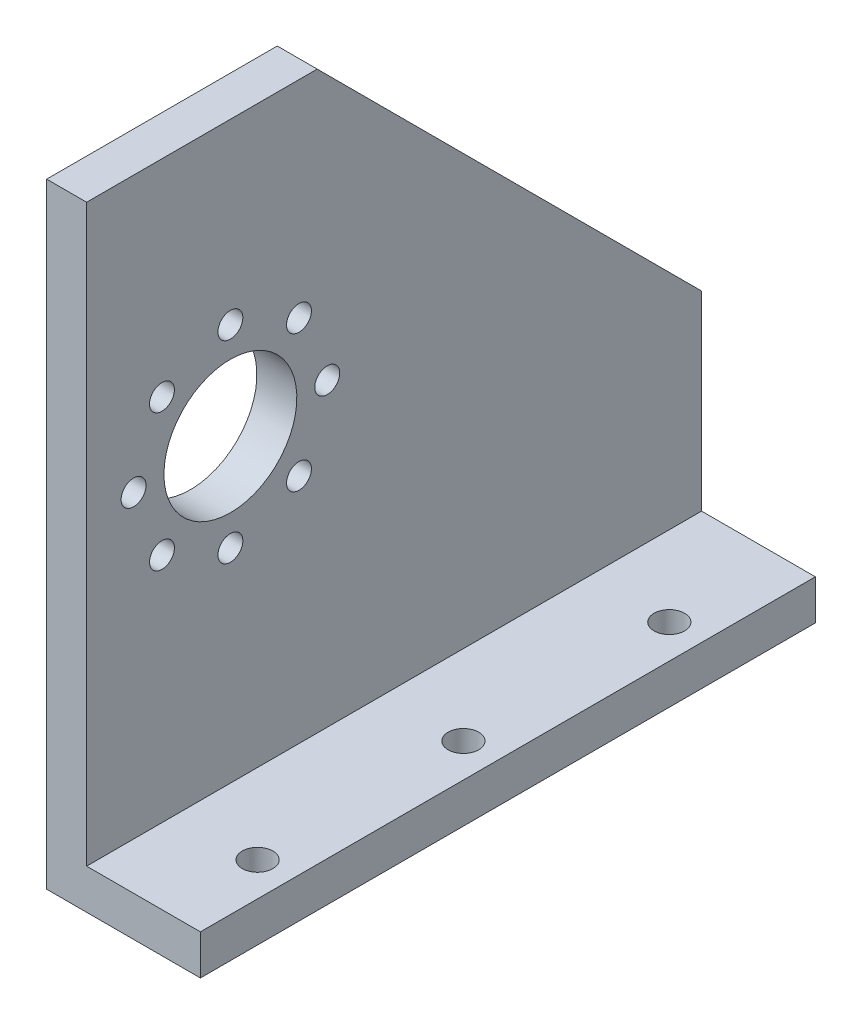
ISO-10303-21;
HEADER;
FILE_DESCRIPTION(('STEP AP214'),'2;1');
FILE_NAME('part.step','',(''),(''),'','','');
FILE_SCHEMA(('AUTOMOTIVE_DESIGN { 1 0 10303 214 1 1 1 1 }'));
ENDSEC;
DATA;
#1=APPLICATION_CONTEXT('core data for automotive mechanical design processes');
#2=APPLICATION_PROTOCOL_DEFINITION('international standard','automotive_design',2000,#1);
#3=PRODUCT_CONTEXT('',#1,'mechanical');
#4=PRODUCT('Part','Part','',(#3));
#5=PRODUCT_RELATED_PRODUCT_CATEGORY('part','',(#4));
#6=PRODUCT_DEFINITION_FORMATION('','',#4);
#7=PRODUCT_DEFINITION_CONTEXT('part definition',#1,'design');
#8=PRODUCT_DEFINITION('design','',#6,#7);
#9=PRODUCT_DEFINITION_SHAPE('','',#8);
#10=(LENGTH_UNIT() NAMED_UNIT(*) SI_UNIT(.MILLI.,.METRE.));
#11=(NAMED_UNIT(*) PLANE_ANGLE_UNIT() SI_UNIT($,.RADIAN.));
#12=(NAMED_UNIT(*) SI_UNIT($,.STERADIAN.) SOLID_ANGLE_UNIT());
#13=UNCERTAINTY_MEASURE_WITH_UNIT(LENGTH_MEASURE(1.E-05),#10,'distance_accuracy_value','');
#14=(GEOMETRIC_REPRESENTATION_CONTEXT(3) GLOBAL_UNCERTAINTY_ASSIGNED_CONTEXT((#13)) GLOBAL_UNIT_ASSIGNED_CONTEXT((#10,
#11,#12)) REPRESENTATION_CONTEXT('',''));
#15=CARTESIAN_POINT('',(0.,0.,0.));
#16=DIRECTION('',(0.,0.,1.));
#17=DIRECTION('',(1.,0.,0.));
#18=AXIS2_PLACEMENT_3D('',#15,#16,#17);
#19=CARTESIAN_POINT('',(12.7,0.,50.8));
#20=DIRECTION('',(0.,1.,0.));
#21=DIRECTION('',(-1.,0.,0.));
#22=AXIS2_PLACEMENT_3D('',#19,#20,#21);
#23=PLANE('',#22);
#24=CARTESIAN_POINT('',(9.90870521282941,0.,43.2834100284563));
#25=DIRECTION('',(0.,-1.,0.));
#26=DIRECTION('',(0.,0.,-1.));
#27=AXIS2_PLACEMENT_3D('',#24,#25,#26);
#28=CIRCLE('',#27,1.26364999999999);
#29=CARTESIAN_POINT('',(9.90870521282941,0.,42.0197600284564));
#30=VERTEX_POINT('',#29);
#31=EDGE_CURVE('E154',#30,#30,#28,.T.);
#32=ORIENTED_EDGE('',*,*,#31,.F.);
#33=EDGE_LOOP('',(#32));
#34=FACE_BOUND('',#33,.T.);
#35=CARTESIAN_POINT('',(9.90870521282941,0.,26.2817034848547));
#36=DIRECTION('',(0.,-1.,0.));
#37=DIRECTION('',(0.,0.,-1.));
#38=AXIS2_PLACEMENT_3D('',#35,#36,#37);
#39=CIRCLE('',#38,1.26364999999999);
#40=CARTESIAN_POINT('',(9.90870521282941,0.,25.0180534848547));
#41=VERTEX_POINT('',#40);
#42=EDGE_CURVE('E151',#41,#41,#39,.T.);
#43=ORIENTED_EDGE('',*,*,#42,.F.);
#44=EDGE_LOOP('',(#43));
#45=FACE_BOUND('',#44,.T.);
#46=CARTESIAN_POINT('',(9.90870521282941,0.,9.2701270850744));
#47=DIRECTION('',(0.,-1.,0.));
#48=DIRECTION('',(0.,0.,-1.));
#49=AXIS2_PLACEMENT_3D('',#46,#47,#48);
#50=CIRCLE('',#49,1.26364999999999);
#51=CARTESIAN_POINT('',(9.90870521282941,0.,8.00647708507442));
#52=VERTEX_POINT('',#51);
#53=EDGE_CURVE('E148',#52,#52,#50,.T.);
#54=ORIENTED_EDGE('',*,*,#53,.F.);
#55=EDGE_LOOP('',(#54));
#56=FACE_BOUND('',#55,.T.);
#57=DIRECTION('',(1.,0.,0.));
#58=VECTOR('',#57,1.);
#59=CARTESIAN_POINT('',(12.7,0.,0.));
#60=LINE('',#59,#58);
#61=CARTESIAN_POINT('',(0.,0.,0.));
#62=VERTEX_POINT('',#61);
#63=CARTESIAN_POINT('',(12.7,0.,0.));
#64=VERTEX_POINT('',#63);
#65=EDGE_CURVE('E127',#62,#64,#60,.T.);
#66=ORIENTED_EDGE('',*,*,#65,.T.);
#67=DIRECTION('',(0.,0.,-1.));
#68=VECTOR('',#67,1.);
#69=CARTESIAN_POINT('',(12.7,0.,50.8));
#70=LINE('',#69,#68);
#71=CARTESIAN_POINT('',(12.7,0.,50.8));
#72=VERTEX_POINT('',#71);
#73=EDGE_CURVE('E45',#72,#64,#70,.T.);
#74=ORIENTED_EDGE('',*,*,#73,.F.);
#75=DIRECTION('',(1.,0.,0.));
#76=VECTOR('',#75,1.);
#77=CARTESIAN_POINT('',(12.7,0.,50.8));
#78=LINE('',#77,#76);
#79=CARTESIAN_POINT('',(0.,0.,50.8));
#80=VERTEX_POINT('',#79);
#81=EDGE_CURVE('E138',#80,#72,#78,.T.);
#82=ORIENTED_EDGE('',*,*,#81,.F.);
#83=DIRECTION('',(0.,0.,-1.));
#84=VECTOR('',#83,1.);
#85=CARTESIAN_POINT('',(0.,0.,50.8));
#86=LINE('',#85,#84);
#87=EDGE_CURVE('E123',#80,#62,#86,.T.);
#88=ORIENTED_EDGE('',*,*,#87,.T.);
#89=EDGE_LOOP('',(#66,#74,#82,#88));
#90=FACE_BOUND('',#89,.T.);
#91=ADVANCED_FACE('F38',(#34,#45,#56,#90),#23,.F.);
#92=CARTESIAN_POINT('',(12.7,3.302,50.8));
#93=DIRECTION('',(-1.,0.,0.));
#94=DIRECTION('',(0.,0.,1.));
#95=AXIS2_PLACEMENT_3D('',#92,#93,#94);
#96=PLANE('',#95);
#97=DIRECTION('',(0.,1.,0.));
#98=VECTOR('',#97,1.);
#99=CARTESIAN_POINT('',(12.7,3.302,0.));
#100=LINE('',#99,#98);
#101=CARTESIAN_POINT('',(12.7,3.302,0.));
#102=VERTEX_POINT('',#101);
#103=EDGE_CURVE('E130',#64,#102,#100,.T.);
#104=ORIENTED_EDGE('',*,*,#103,.T.);
#105=DIRECTION('',(0.,0.,-1.));
#106=VECTOR('',#105,1.);
#107=CARTESIAN_POINT('',(12.7,3.302,50.8));
#108=LINE('',#107,#106);
#109=CARTESIAN_POINT('',(12.7,3.302,50.8));
#110=VERTEX_POINT('',#109);
#111=EDGE_CURVE('E142',#110,#102,#108,.T.);
#112=ORIENTED_EDGE('',*,*,#111,.F.);
#113=DIRECTION('',(0.,1.,0.));
#114=VECTOR('',#113,1.);
#115=CARTESIAN_POINT('',(12.7,3.302,50.8));
#116=LINE('',#115,#114);
#117=EDGE_CURVE('E90',#72,#110,#116,.T.);
#118=ORIENTED_EDGE('',*,*,#117,.F.);
#119=ORIENTED_EDGE('',*,*,#73,.T.);
#120=EDGE_LOOP('',(#104,#112,#118,#119));
#121=FACE_BOUND('',#120,.T.);
#122=ADVANCED_FACE('F174',(#121),#96,.F.);
#123=CARTESIAN_POINT('',(3.30200000000001,3.302,50.8));
#124=DIRECTION('',(0.,-1.,0.));
#125=DIRECTION('',(1.,0.,0.));
#126=AXIS2_PLACEMENT_3D('',#123,#124,#125);
#127=PLANE('',#126);
#128=CARTESIAN_POINT('',(9.90870521282941,3.302,43.2834100284563));
#129=DIRECTION('',(0.,-1.,0.));
#130=DIRECTION('',(1.,0.,0.));
#131=AXIS2_PLACEMENT_3D('',#128,#129,#130);
#132=CIRCLE('',#131,1.26364999999999);
#133=CARTESIAN_POINT('',(11.1723552128294,3.302,43.2834100284563));
#134=VERTEX_POINT('',#133);
#135=EDGE_CURVE('E152',#134,#134,#132,.T.);
#136=ORIENTED_EDGE('',*,*,#135,.T.);
#137=EDGE_LOOP('',(#136));
#138=FACE_BOUND('',#137,.T.);
#139=CARTESIAN_POINT('',(9.90870521282941,3.302,26.2817034848547));
#140=DIRECTION('',(0.,-1.,0.));
#141=DIRECTION('',(1.,0.,0.));
#142=AXIS2_PLACEMENT_3D('',#139,#140,#141);
#143=CIRCLE('',#142,1.26364999999999);
#144=CARTESIAN_POINT('',(11.1723552128294,3.302,26.2817034848547));
#145=VERTEX_POINT('',#144);
#146=EDGE_CURVE('E149',#145,#145,#143,.T.);
#147=ORIENTED_EDGE('',*,*,#146,.T.);
#148=EDGE_LOOP('',(#147));
#149=FACE_BOUND('',#148,.T.);
#150=CARTESIAN_POINT('',(9.90870521282941,3.302,9.2701270850744));
#151=DIRECTION('',(0.,-1.,0.));
#152=DIRECTION('',(1.,0.,0.));
#153=AXIS2_PLACEMENT_3D('',#150,#151,#152);
#154=CIRCLE('',#153,1.26364999999999);
#155=CARTESIAN_POINT('',(11.1723552128294,3.302,9.2701270850744));
#156=VERTEX_POINT('',#155);
#157=EDGE_CURVE('E131',#156,#156,#154,.T.);
#158=ORIENTED_EDGE('',*,*,#157,.T.);
#159=EDGE_LOOP('',(#158));
#160=FACE_BOUND('',#159,.T.);
#161=DIRECTION('',(-1.,0.,0.));
#162=VECTOR('',#161,1.);
#163=CARTESIAN_POINT('',(3.30200000000001,3.302,0.));
#164=LINE('',#163,#162);
#165=CARTESIAN_POINT('',(3.30200000000001,3.302,0.));
#166=VERTEX_POINT('',#165);
#167=EDGE_CURVE('E133',#102,#166,#164,.T.);
#168=ORIENTED_EDGE('',*,*,#167,.T.);
#169=DIRECTION('',(0.,0.,-1.));
#170=VECTOR('',#169,1.);
#171=CARTESIAN_POINT('',(3.30200000000001,3.302,50.8));
#172=LINE('',#171,#170);
#173=CARTESIAN_POINT('',(3.30200000000001,3.302,50.8));
#174=VERTEX_POINT('',#173);
#175=EDGE_CURVE('E117',#174,#166,#172,.T.);
#176=ORIENTED_EDGE('',*,*,#175,.F.);
#177=DIRECTION('',(-1.,0.,0.));
#178=VECTOR('',#177,1.);
#179=CARTESIAN_POINT('',(3.30200000000001,3.302,50.8));
#180=LINE('',#179,#178);
#181=EDGE_CURVE('E106',#110,#174,#180,.T.);
#182=ORIENTED_EDGE('',*,*,#181,.F.);
#183=ORIENTED_EDGE('',*,*,#111,.T.);
#184=EDGE_LOOP('',(#168,#176,#182,#183));
#185=FACE_BOUND('',#184,.T.);
#186=ADVANCED_FACE('F177',(#138,#149,#160,#185),#127,.F.);
#187=CARTESIAN_POINT('',(3.302,50.8,50.8));
#188=DIRECTION('',(-1.,0.,0.));
#189=DIRECTION('',(0.,-1.,0.));
#190=AXIS2_PLACEMENT_3D('',#187,#188,#189);
#191=PLANE('',#190);
#192=CARTESIAN_POINT('',(3.302,28.1327030708297,38.9240521092831));
#193=DIRECTION('',(-1.,0.,0.));
#194=DIRECTION('',(0.,-1.,0.));
#195=AXIS2_PLACEMENT_3D('',#192,#193,#194);
#196=CIRCLE('',#195,5.48985451159772);
#197=CARTESIAN_POINT('',(3.302,22.6428485592319,38.9240521092831));
#198=VERTEX_POINT('',#197);
#199=EDGE_CURVE('E196',#198,#198,#196,.T.);
#200=ORIENTED_EDGE('',*,*,#199,.T.);
#201=EDGE_LOOP('',(#200));
#202=FACE_BOUND('',#201,.T.);
#203=CARTESIAN_POINT('',(3.302,20.1327030708297,38.9240521092829));
#204=DIRECTION('',(-1.,0.,0.));
#205=DIRECTION('',(0.,-1.,0.));
#206=AXIS2_PLACEMENT_3D('',#203,#204,#205);
#207=CIRCLE('',#206,1.0287);
#208=CARTESIAN_POINT('',(3.302,19.1040030708297,38.9240521092829));
#209=VERTEX_POINT('',#208);
#210=EDGE_CURVE('E202',#209,#209,#207,.T.);
#211=ORIENTED_EDGE('',*,*,#210,.T.);
#212=EDGE_LOOP('',(#211));
#213=FACE_BOUND('',#212,.T.);
#214=CARTESIAN_POINT('',(3.302,22.4501495097673,33.2567320007666));
#215=DIRECTION('',(-1.,0.,0.));
#216=DIRECTION('',(0.,-1.,0.));
#217=AXIS2_PLACEMENT_3D('',#214,#215,#216);
#218=CIRCLE('',#217,1.0287);
#219=CARTESIAN_POINT('',(3.302,21.4214495097673,33.2567320007666));
#220=VERTEX_POINT('',#219);
#221=EDGE_CURVE('E208',#220,#220,#218,.T.);
#222=ORIENTED_EDGE('',*,*,#221,.T.);
#223=EDGE_LOOP('',(#222));
#224=FACE_BOUND('',#223,.T.);
#225=CARTESIAN_POINT('',(3.302,28.1327030708298,30.924052109283));
#226=DIRECTION('',(-1.,0.,0.));
#227=DIRECTION('',(0.,-1.,0.));
#228=AXIS2_PLACEMENT_3D('',#225,#226,#227);
#229=CIRCLE('',#228,1.0287);
#230=CARTESIAN_POINT('',(3.302,27.1040030708298,30.924052109283));
#231=VERTEX_POINT('',#230);
#232=EDGE_CURVE('E214',#231,#231,#229,.T.);
#233=ORIENTED_EDGE('',*,*,#232,.T.);
#234=EDGE_LOOP('',(#233));
#235=FACE_BOUND('',#234,.T.);
#236=CARTESIAN_POINT('',(3.302,33.7546085060607,33.2567320007666));
#237=DIRECTION('',(-1.,0.,0.));
#238=DIRECTION('',(0.,-1.,0.));
#239=AXIS2_PLACEMENT_3D('',#236,#237,#238);
#240=CIRCLE('',#239,1.0287);
#241=CARTESIAN_POINT('',(3.302,32.7259085060607,33.2567320007666));
#242=VERTEX_POINT('',#241);
#243=EDGE_CURVE('E220',#242,#242,#240,.T.);
#244=ORIENTED_EDGE('',*,*,#243,.T.);
#245=EDGE_LOOP('',(#244));
#246=FACE_BOUND('',#245,.T.);
#247=CARTESIAN_POINT('',(3.302,36.0967673231195,38.9240521092829));
#248=DIRECTION('',(-1.,0.,0.));
#249=DIRECTION('',(0.,-1.,0.));
#250=AXIS2_PLACEMENT_3D('',#247,#248,#249);
#251=CIRCLE('',#250,1.0287);
#252=CARTESIAN_POINT('',(3.302,35.0680673231195,38.9240521092829));
#253=VERTEX_POINT('',#252);
#254=EDGE_CURVE('E226',#253,#253,#251,.T.);
#255=ORIENTED_EDGE('',*,*,#254,.T.);
#256=EDGE_LOOP('',(#255));
#257=FACE_BOUND('',#256,.T.);
#258=CARTESIAN_POINT('',(3.302,33.7636673841721,44.5765883182915));
#259=DIRECTION('',(-1.,0.,0.));
#260=DIRECTION('',(0.,-1.,0.));
#261=AXIS2_PLACEMENT_3D('',#258,#259,#260);
#262=CIRCLE('',#261,1.0287);
#263=CARTESIAN_POINT('',(3.302,32.7349673841721,44.5765883182915));
#264=VERTEX_POINT('',#263);
#265=EDGE_CURVE('E232',#264,#264,#262,.T.);
#266=ORIENTED_EDGE('',*,*,#265,.T.);
#267=EDGE_LOOP('',(#266));
#268=FACE_BOUND('',#267,.T.);
#269=CARTESIAN_POINT('',(3.302,28.1016040637977,46.9216527691961));
#270=DIRECTION('',(-1.,0.,0.));
#271=DIRECTION('',(0.,-1.,0.));
#272=AXIS2_PLACEMENT_3D('',#269,#270,#271);
#273=CIRCLE('',#272,1.0287);
#274=CARTESIAN_POINT('',(3.302,27.0729040637977,46.9216527691961));
#275=VERTEX_POINT('',#274);
#276=EDGE_CURVE('E238',#275,#275,#273,.T.);
#277=ORIENTED_EDGE('',*,*,#276,.T.);
#278=EDGE_LOOP('',(#277));
#279=FACE_BOUND('',#278,.T.);
#280=CARTESIAN_POINT('',(3.302,22.4501495097673,44.5765883182915));
#281=DIRECTION('',(-1.,0.,0.));
#282=DIRECTION('',(0.,-1.,0.));
#283=AXIS2_PLACEMENT_3D('',#280,#281,#282);
#284=CIRCLE('',#283,1.0287);
#285=CARTESIAN_POINT('',(3.302,21.4214495097673,44.5765883182915));
#286=VERTEX_POINT('',#285);
#287=EDGE_CURVE('E160',#286,#286,#284,.T.);
#288=ORIENTED_EDGE('',*,*,#287,.T.);
#289=EDGE_LOOP('',(#288));
#290=FACE_BOUND('',#289,.T.);
#291=DIRECTION('',(0.,1.,0.));
#292=VECTOR('',#291,1.);
#293=CARTESIAN_POINT('',(3.302,50.8,0.));
#294=LINE('',#293,#292);
#295=CARTESIAN_POINT('',(3.302,19.05,0.));
#296=VERTEX_POINT('',#295);
#297=EDGE_CURVE('E135',#166,#296,#294,.T.);
#298=ORIENTED_EDGE('',*,*,#297,.T.);
#299=DIRECTION('',(0.,0.707106781186548,0.707106781186548));
#300=VECTOR('',#299,1.);
#301=CARTESIAN_POINT('',(3.302,60.325,41.275));
#302=LINE('',#301,#300);
#303=CARTESIAN_POINT('',(3.302,50.8,31.75));
#304=VERTEX_POINT('',#303);
#305=EDGE_CURVE('E51',#296,#304,#302,.T.);
#306=ORIENTED_EDGE('',*,*,#305,.T.);
#307=DIRECTION('',(0.,0.,-1.));
#308=VECTOR('',#307,1.);
#309=CARTESIAN_POINT('',(3.302,50.8,50.8));
#310=LINE('',#309,#308);
#311=CARTESIAN_POINT('',(3.302,50.8,50.8));
#312=VERTEX_POINT('',#311);
#313=EDGE_CURVE('E112',#312,#304,#310,.T.);
#314=ORIENTED_EDGE('',*,*,#313,.F.);
#315=DIRECTION('',(0.,1.,0.));
#316=VECTOR('',#315,1.);
#317=CARTESIAN_POINT('',(3.302,50.8,50.8));
#318=LINE('',#317,#316);
#319=EDGE_CURVE('E99',#174,#312,#318,.T.);
#320=ORIENTED_EDGE('',*,*,#319,.F.);
#321=ORIENTED_EDGE('',*,*,#175,.T.);
#322=EDGE_LOOP('',(#298,#306,#314,#320,#321));
#323=FACE_BOUND('',#322,.T.);
#324=ADVANCED_FACE('F114',(#202,#213,#224,#235,#246,#257,#268,#279,#290,#323),#191,.F.);
#325=CARTESIAN_POINT('',(0.,50.8,50.8));
#326=DIRECTION('',(0.,-1.,0.));
#327=DIRECTION('',(0.,0.,-1.));
#328=AXIS2_PLACEMENT_3D('',#325,#326,#327);
#329=PLANE('',#328);
#330=ORIENTED_EDGE('',*,*,#313,.T.);
#331=DIRECTION('',(-1.,0.,0.));
#332=VECTOR('',#331,1.);
#333=CARTESIAN_POINT('',(12.7,50.8,31.75));
#334=LINE('',#333,#332);
#335=CARTESIAN_POINT('',(0.,50.8,31.75));
#336=VERTEX_POINT('',#335);
#337=EDGE_CURVE('E189',#304,#336,#334,.T.);
#338=ORIENTED_EDGE('',*,*,#337,.T.);
#339=DIRECTION('',(0.,0.,-1.));
#340=VECTOR('',#339,1.);
#341=CARTESIAN_POINT('',(0.,50.8,50.8));
#342=LINE('',#341,#340);
#343=CARTESIAN_POINT('',(0.,50.8,50.8));
#344=VERTEX_POINT('',#343);
#345=EDGE_CURVE('E118',#344,#336,#342,.T.);
#346=ORIENTED_EDGE('',*,*,#345,.F.);
#347=DIRECTION('',(-1.,0.,0.));
#348=VECTOR('',#347,1.);
#349=CARTESIAN_POINT('',(0.,50.8,50.8));
#350=LINE('',#349,#348);
#351=EDGE_CURVE('E103',#312,#344,#350,.T.);
#352=ORIENTED_EDGE('',*,*,#351,.F.);
#353=EDGE_LOOP('',(#330,#338,#346,#352));
#354=FACE_BOUND('',#353,.T.);
#355=ADVANCED_FACE('F120',(#354),#329,.F.);
#356=CARTESIAN_POINT('',(0.,0.,50.8));
#357=DIRECTION('',(1.,0.,0.));
#358=DIRECTION('',(0.,0.,-1.));
#359=AXIS2_PLACEMENT_3D('',#356,#357,#358);
#360=PLANE('',#359);
#361=CARTESIAN_POINT('',(0.,28.1327030708297,38.9240521092831));
#362=DIRECTION('',(-1.,0.,0.));
#363=DIRECTION('',(0.,0.,1.));
#364=AXIS2_PLACEMENT_3D('',#361,#362,#363);
#365=CIRCLE('',#364,5.48985451159772);
#366=CARTESIAN_POINT('',(0.,28.1327030708297,44.4139066208808));
#367=VERTEX_POINT('',#366);
#368=EDGE_CURVE('E188',#367,#367,#365,.T.);
#369=ORIENTED_EDGE('',*,*,#368,.F.);
#370=EDGE_LOOP('',(#369));
#371=FACE_BOUND('',#370,.T.);
#372=CARTESIAN_POINT('',(0.,20.1327030708297,38.9240521092829));
#373=DIRECTION('',(-1.,0.,0.));
#374=DIRECTION('',(0.,0.,1.));
#375=AXIS2_PLACEMENT_3D('',#372,#373,#374);
#376=CIRCLE('',#375,1.0287);
#377=CARTESIAN_POINT('',(0.,20.1327030708297,39.9527521092829));
#378=VERTEX_POINT('',#377);
#379=EDGE_CURVE('E199',#378,#378,#376,.T.);
#380=ORIENTED_EDGE('',*,*,#379,.F.);
#381=EDGE_LOOP('',(#380));
#382=FACE_BOUND('',#381,.T.);
#383=CARTESIAN_POINT('',(0.,22.4501495097673,33.2567320007666));
#384=DIRECTION('',(-1.,0.,0.));
#385=DIRECTION('',(0.,0.,1.));
#386=AXIS2_PLACEMENT_3D('',#383,#384,#385);
#387=CIRCLE('',#386,1.0287);
#388=CARTESIAN_POINT('',(0.,22.4501495097673,34.2854320007666));
#389=VERTEX_POINT('',#388);
#390=EDGE_CURVE('E205',#389,#389,#387,.T.);
#391=ORIENTED_EDGE('',*,*,#390,.F.);
#392=EDGE_LOOP('',(#391));
#393=FACE_BOUND('',#392,.T.);
#394=CARTESIAN_POINT('',(0.,28.1327030708298,30.924052109283));
#395=DIRECTION('',(-1.,0.,0.));
#396=DIRECTION('',(0.,0.,1.));
#397=AXIS2_PLACEMENT_3D('',#394,#395,#396);
#398=CIRCLE('',#397,1.0287);
#399=CARTESIAN_POINT('',(0.,28.1327030708298,31.952752109283));
#400=VERTEX_POINT('',#399);
#401=EDGE_CURVE('E211',#400,#400,#398,.T.);
#402=ORIENTED_EDGE('',*,*,#401,.F.);
#403=EDGE_LOOP('',(#402));
#404=FACE_BOUND('',#403,.T.);
#405=CARTESIAN_POINT('',(0.,33.7546085060607,33.2567320007666));
#406=DIRECTION('',(-1.,0.,0.));
#407=DIRECTION('',(0.,0.,1.));
#408=AXIS2_PLACEMENT_3D('',#405,#406,#407);
#409=CIRCLE('',#408,1.0287);
#410=CARTESIAN_POINT('',(0.,33.7546085060607,34.2854320007666));
#411=VERTEX_POINT('',#410);
#412=EDGE_CURVE('E217',#411,#411,#409,.T.);
#413=ORIENTED_EDGE('',*,*,#412,.F.);
#414=EDGE_LOOP('',(#413));
#415=FACE_BOUND('',#414,.T.);
#416=CARTESIAN_POINT('',(0.,36.0967673231195,38.9240521092829));
#417=DIRECTION('',(-1.,0.,0.));
#418=DIRECTION('',(0.,0.,1.));
#419=AXIS2_PLACEMENT_3D('',#416,#417,#418);
#420=CIRCLE('',#419,1.0287);
#421=CARTESIAN_POINT('',(0.,36.0967673231195,39.9527521092829));
#422=VERTEX_POINT('',#421);
#423=EDGE_CURVE('E223',#422,#422,#420,.T.);
#424=ORIENTED_EDGE('',*,*,#423,.F.);
#425=EDGE_LOOP('',(#424));
#426=FACE_BOUND('',#425,.T.);
#427=CARTESIAN_POINT('',(0.,33.7636673841721,44.5765883182915));
#428=DIRECTION('',(-1.,0.,0.));
#429=DIRECTION('',(0.,0.,1.));
#430=AXIS2_PLACEMENT_3D('',#427,#428,#429);
#431=CIRCLE('',#430,1.0287);
#432=CARTESIAN_POINT('',(0.,33.7636673841721,45.6052883182915));
#433=VERTEX_POINT('',#432);
#434=EDGE_CURVE('E229',#433,#433,#431,.T.);
#435=ORIENTED_EDGE('',*,*,#434,.F.);
#436=EDGE_LOOP('',(#435));
#437=FACE_BOUND('',#436,.T.);
#438=CARTESIAN_POINT('',(0.,28.1016040637977,46.9216527691961));
#439=DIRECTION('',(-1.,0.,0.));
#440=DIRECTION('',(0.,0.,1.));
#441=AXIS2_PLACEMENT_3D('',#438,#439,#440);
#442=CIRCLE('',#441,1.0287);
#443=CARTESIAN_POINT('',(0.,28.1016040637977,47.9503527691961));
#444=VERTEX_POINT('',#443);
#445=EDGE_CURVE('E235',#444,#444,#442,.T.);
#446=ORIENTED_EDGE('',*,*,#445,.F.);
#447=EDGE_LOOP('',(#446));
#448=FACE_BOUND('',#447,.T.);
#449=CARTESIAN_POINT('',(0.,22.4501495097673,44.5765883182915));
#450=DIRECTION('',(-1.,0.,0.));
#451=DIRECTION('',(0.,0.,1.));
#452=AXIS2_PLACEMENT_3D('',#449,#450,#451);
#453=CIRCLE('',#452,1.0287);
#454=CARTESIAN_POINT('',(0.,22.4501495097673,45.6052883182915));
#455=VERTEX_POINT('',#454);
#456=EDGE_CURVE('E165',#455,#455,#453,.T.);
#457=ORIENTED_EDGE('',*,*,#456,.F.);
#458=EDGE_LOOP('',(#457));
#459=FACE_BOUND('',#458,.T.);
#460=ORIENTED_EDGE('',*,*,#345,.T.);
#461=DIRECTION('',(0.,0.707106781186548,0.707106781186548));
#462=VECTOR('',#461,1.);
#463=CARTESIAN_POINT('',(0.,19.05,0.));
#464=LINE('',#463,#462);
#465=CARTESIAN_POINT('',(0.,19.05,0.));
#466=VERTEX_POINT('',#465);
#467=EDGE_CURVE('E186',#466,#336,#464,.T.);
#468=ORIENTED_EDGE('',*,*,#467,.F.);
#469=DIRECTION('',(0.,-1.,0.));
#470=VECTOR('',#469,1.);
#471=CARTESIAN_POINT('',(0.,0.,0.));
#472=LINE('',#471,#470);
#473=EDGE_CURVE('E81',#466,#62,#472,.T.);
#474=ORIENTED_EDGE('',*,*,#473,.T.);
#475=ORIENTED_EDGE('',*,*,#87,.F.);
#476=DIRECTION('',(0.,-1.,0.));
#477=VECTOR('',#476,1.);
#478=CARTESIAN_POINT('',(0.,0.,50.8));
#479=LINE('',#478,#477);
#480=EDGE_CURVE('E60',#344,#80,#479,.T.);
#481=ORIENTED_EDGE('',*,*,#480,.F.);
#482=EDGE_LOOP('',(#460,#468,#474,#475,#481));
#483=FACE_BOUND('',#482,.T.);
#484=ADVANCED_FACE('F187',(#371,#382,#393,#404,#415,#426,#437,#448,#459,#483),#360,.F.);
#485=CARTESIAN_POINT('',(0.,0.,50.8));
#486=DIRECTION('',(0.,0.,-1.));
#487=DIRECTION('',(-1.,0.,0.));
#488=AXIS2_PLACEMENT_3D('',#485,#486,#487);
#489=PLANE('',#488);
#490=ORIENTED_EDGE('',*,*,#81,.T.);
#491=ORIENTED_EDGE('',*,*,#117,.T.);
#492=ORIENTED_EDGE('',*,*,#181,.T.);
#493=ORIENTED_EDGE('',*,*,#319,.T.);
#494=ORIENTED_EDGE('',*,*,#351,.T.);
#495=ORIENTED_EDGE('',*,*,#480,.T.);
#496=EDGE_LOOP('',(#490,#491,#492,#493,#494,#495));
#497=FACE_BOUND('',#496,.T.);
#498=ADVANCED_FACE('F101',(#497),#489,.F.);
#499=CARTESIAN_POINT('',(0.,0.,0.));
#500=DIRECTION('',(0.,0.,-1.));
#501=DIRECTION('',(-1.,0.,0.));
#502=AXIS2_PLACEMENT_3D('',#499,#500,#501);
#503=PLANE('',#502);
#504=DIRECTION('',(-1.,0.,0.));
#505=VECTOR('',#504,1.);
#506=CARTESIAN_POINT('',(0.,19.05,0.));
#507=LINE('',#506,#505);
#508=EDGE_CURVE('E11',#296,#466,#507,.T.);
#509=ORIENTED_EDGE('',*,*,#508,.F.);
#510=ORIENTED_EDGE('',*,*,#297,.F.);
#511=ORIENTED_EDGE('',*,*,#167,.F.);
#512=ORIENTED_EDGE('',*,*,#103,.F.);
#513=ORIENTED_EDGE('',*,*,#65,.F.);
#514=ORIENTED_EDGE('',*,*,#473,.F.);
#515=EDGE_LOOP('',(#509,#510,#511,#512,#513,#514));
#516=FACE_BOUND('',#515,.T.);
#517=ADVANCED_FACE('F180',(#516),#503,.T.);
#518=CARTESIAN_POINT('',(9.90870521282941,0.,9.2701270850744));
#519=DIRECTION('',(0.,-1.,0.));
#520=DIRECTION('',(0.,0.,-1.));
#521=AXIS2_PLACEMENT_3D('',#518,#519,#520);
#522=CYLINDRICAL_SURFACE('',#521,1.26364999999999);
#523=ORIENTED_EDGE('',*,*,#53,.T.);
#524=EDGE_LOOP('',(#523));
#525=FACE_BOUND('',#524,.T.);
#526=ORIENTED_EDGE('',*,*,#157,.F.);
#527=EDGE_LOOP('',(#526));
#528=FACE_BOUND('',#527,.T.);
#529=ADVANCED_FACE('F269',(#525,#528),#522,.F.);
#530=CARTESIAN_POINT('',(9.90870521282941,0.,26.2817034848547));
#531=DIRECTION('',(0.,-1.,0.));
#532=DIRECTION('',(0.,0.,-1.));
#533=AXIS2_PLACEMENT_3D('',#530,#531,#532);
#534=CYLINDRICAL_SURFACE('',#533,1.26364999999999);
#535=ORIENTED_EDGE('',*,*,#42,.T.);
#536=EDGE_LOOP('',(#535));
#537=FACE_BOUND('',#536,.T.);
#538=ORIENTED_EDGE('',*,*,#146,.F.);
#539=EDGE_LOOP('',(#538));
#540=FACE_BOUND('',#539,.T.);
#541=ADVANCED_FACE('F272',(#537,#540),#534,.F.);
#542=CARTESIAN_POINT('',(9.90870521282941,0.,43.2834100284563));
#543=DIRECTION('',(0.,-1.,0.));
#544=DIRECTION('',(0.,0.,-1.));
#545=AXIS2_PLACEMENT_3D('',#542,#543,#544);
#546=CYLINDRICAL_SURFACE('',#545,1.26364999999999);
#547=ORIENTED_EDGE('',*,*,#31,.T.);
#548=EDGE_LOOP('',(#547));
#549=FACE_BOUND('',#548,.T.);
#550=ORIENTED_EDGE('',*,*,#135,.F.);
#551=EDGE_LOOP('',(#550));
#552=FACE_BOUND('',#551,.T.);
#553=ADVANCED_FACE('F287',(#549,#552),#546,.F.);
#554=CARTESIAN_POINT('',(0.,22.4501495097673,44.5765883182915));
#555=DIRECTION('',(-1.,0.,0.));
#556=DIRECTION('',(0.,0.,1.));
#557=AXIS2_PLACEMENT_3D('',#554,#555,#556);
#558=CYLINDRICAL_SURFACE('',#557,1.0287);
#559=ORIENTED_EDGE('',*,*,#456,.T.);
#560=EDGE_LOOP('',(#559));
#561=FACE_BOUND('',#560,.T.);
#562=ORIENTED_EDGE('',*,*,#287,.F.);
#563=EDGE_LOOP('',(#562));
#564=FACE_BOUND('',#563,.T.);
#565=ADVANCED_FACE('F243',(#561,#564),#558,.F.);
#566=CARTESIAN_POINT('',(0.,28.1016040637977,46.9216527691961));
#567=DIRECTION('',(-1.,0.,0.));
#568=DIRECTION('',(0.,0.,1.));
#569=AXIS2_PLACEMENT_3D('',#566,#567,#568);
#570=CYLINDRICAL_SURFACE('',#569,1.0287);
#571=ORIENTED_EDGE('',*,*,#445,.T.);
#572=EDGE_LOOP('',(#571));
#573=FACE_BOUND('',#572,.T.);
#574=ORIENTED_EDGE('',*,*,#276,.F.);
#575=EDGE_LOOP('',(#574));
#576=FACE_BOUND('',#575,.T.);
#577=ADVANCED_FACE('F329',(#573,#576),#570,.F.);
#578=CARTESIAN_POINT('',(0.,33.7636673841721,44.5765883182915));
#579=DIRECTION('',(-1.,0.,0.));
#580=DIRECTION('',(0.,0.,1.));
#581=AXIS2_PLACEMENT_3D('',#578,#579,#580);
#582=CYLINDRICAL_SURFACE('',#581,1.0287);
#583=ORIENTED_EDGE('',*,*,#434,.T.);
#584=EDGE_LOOP('',(#583));
#585=FACE_BOUND('',#584,.T.);
#586=ORIENTED_EDGE('',*,*,#265,.F.);
#587=EDGE_LOOP('',(#586));
#588=FACE_BOUND('',#587,.T.);
#589=ADVANCED_FACE('F338',(#585,#588),#582,.F.);
#590=CARTESIAN_POINT('',(0.,36.0967673231195,38.9240521092829));
#591=DIRECTION('',(-1.,0.,0.));
#592=DIRECTION('',(0.,0.,1.));
#593=AXIS2_PLACEMENT_3D('',#590,#591,#592);
#594=CYLINDRICAL_SURFACE('',#593,1.0287);
#595=ORIENTED_EDGE('',*,*,#423,.T.);
#596=EDGE_LOOP('',(#595));
#597=FACE_BOUND('',#596,.T.);
#598=ORIENTED_EDGE('',*,*,#254,.F.);
#599=EDGE_LOOP('',(#598));
#600=FACE_BOUND('',#599,.T.);
#601=ADVANCED_FACE('F349',(#597,#600),#594,.F.);
#602=CARTESIAN_POINT('',(0.,33.7546085060607,33.2567320007666));
#603=DIRECTION('',(-1.,0.,0.));
#604=DIRECTION('',(0.,0.,1.));
#605=AXIS2_PLACEMENT_3D('',#602,#603,#604);
#606=CYLINDRICAL_SURFACE('',#605,1.0287);
#607=ORIENTED_EDGE('',*,*,#412,.T.);
#608=EDGE_LOOP('',(#607));
#609=FACE_BOUND('',#608,.T.);
#610=ORIENTED_EDGE('',*,*,#243,.F.);
#611=EDGE_LOOP('',(#610));
#612=FACE_BOUND('',#611,.T.);
#613=ADVANCED_FACE('F360',(#609,#612),#606,.F.);
#614=CARTESIAN_POINT('',(0.,28.1327030708298,30.924052109283));
#615=DIRECTION('',(-1.,0.,0.));
#616=DIRECTION('',(0.,0.,1.));
#617=AXIS2_PLACEMENT_3D('',#614,#615,#616);
#618=CYLINDRICAL_SURFACE('',#617,1.0287);
#619=ORIENTED_EDGE('',*,*,#401,.T.);
#620=EDGE_LOOP('',(#619));
#621=FACE_BOUND('',#620,.T.);
#622=ORIENTED_EDGE('',*,*,#232,.F.);
#623=EDGE_LOOP('',(#622));
#624=FACE_BOUND('',#623,.T.);
#625=ADVANCED_FACE('F371',(#621,#624),#618,.F.);
#626=CARTESIAN_POINT('',(0.,22.4501495097673,33.2567320007666));
#627=DIRECTION('',(-1.,0.,0.));
#628=DIRECTION('',(0.,0.,1.));
#629=AXIS2_PLACEMENT_3D('',#626,#627,#628);
#630=CYLINDRICAL_SURFACE('',#629,1.0287);
#631=ORIENTED_EDGE('',*,*,#390,.T.);
#632=EDGE_LOOP('',(#631));
#633=FACE_BOUND('',#632,.T.);
#634=ORIENTED_EDGE('',*,*,#221,.F.);
#635=EDGE_LOOP('',(#634));
#636=FACE_BOUND('',#635,.T.);
#637=ADVANCED_FACE('F382',(#633,#636),#630,.F.);
#638=CARTESIAN_POINT('',(0.,20.1327030708297,38.9240521092829));
#639=DIRECTION('',(-1.,0.,0.));
#640=DIRECTION('',(0.,0.,1.));
#641=AXIS2_PLACEMENT_3D('',#638,#639,#640);
#642=CYLINDRICAL_SURFACE('',#641,1.0287);
#643=ORIENTED_EDGE('',*,*,#379,.T.);
#644=EDGE_LOOP('',(#643));
#645=FACE_BOUND('',#644,.T.);
#646=ORIENTED_EDGE('',*,*,#210,.F.);
#647=EDGE_LOOP('',(#646));
#648=FACE_BOUND('',#647,.T.);
#649=ADVANCED_FACE('F393',(#645,#648),#642,.F.);
#650=CARTESIAN_POINT('',(12.7,19.05,0.));
#651=DIRECTION('',(0.,-0.707106781186548,0.707106781186548));
#652=DIRECTION('',(0.,-0.707106781186548,-0.707106781186548));
#653=AXIS2_PLACEMENT_3D('',#650,#651,#652);
#654=PLANE('',#653);
#655=ORIENTED_EDGE('',*,*,#508,.T.);
#656=ORIENTED_EDGE('',*,*,#467,.T.);
#657=ORIENTED_EDGE('',*,*,#337,.F.);
#658=ORIENTED_EDGE('',*,*,#305,.F.);
#659=EDGE_LOOP('',(#655,#656,#657,#658));
#660=FACE_BOUND('',#659,.T.);
#661=ADVANCED_FACE('F184',(#660),#654,.F.);
#662=CARTESIAN_POINT('',(12.7,28.1327030708297,38.9240521092831));
#663=DIRECTION('',(-1.,0.,0.));
#664=DIRECTION('',(0.,0.,1.));
#665=AXIS2_PLACEMENT_3D('',#662,#663,#664);
#666=CYLINDRICAL_SURFACE('',#665,5.48985451159772);
#667=ORIENTED_EDGE('',*,*,#368,.T.);
#668=EDGE_LOOP('',(#667));
#669=FACE_BOUND('',#668,.T.);
#670=ORIENTED_EDGE('',*,*,#199,.F.);
#671=EDGE_LOOP('',(#670));
#672=FACE_BOUND('',#671,.T.);
#673=ADVANCED_FACE('F456',(#669,#672),#666,.F.);
#674=CLOSED_SHELL('',(#91,#122,#186,#324,#355,#484,#498,#517,#529,#541,#553,#565,#577,#589,#601,
#613,#625,#637,#649,#661,#673));
#675=MANIFOLD_SOLID_BREP('B2',#674);
#676=ADVANCED_BREP_SHAPE_REPRESENTATION('',(#18,#675),#14);
#677=SHAPE_DEFINITION_REPRESENTATION(#9,#676);
ENDSEC;
END-ISO-10303-21;
